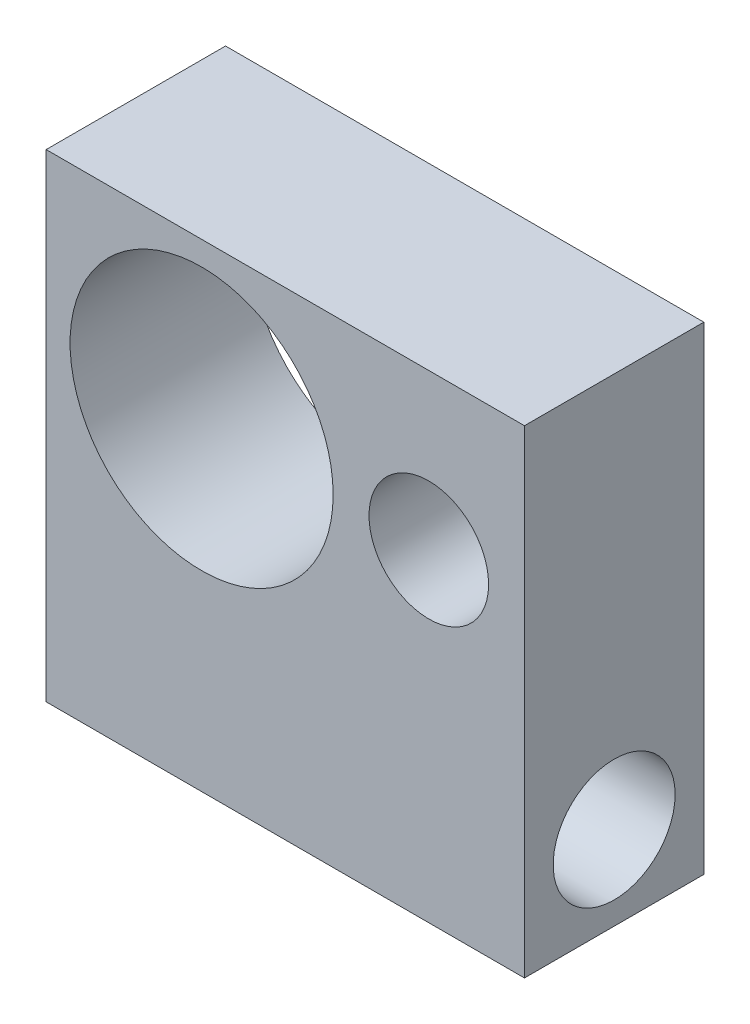
ISO-10303-21;
HEADER;
FILE_DESCRIPTION(('STEP AP214'),'2;1');
FILE_NAME('part.step','',(''),(''),'','','');
FILE_SCHEMA(('AUTOMOTIVE_DESIGN { 1 0 10303 214 1 1 1 1 }'));
ENDSEC;
DATA;
#1=APPLICATION_CONTEXT('core data for automotive mechanical design processes');
#2=APPLICATION_PROTOCOL_DEFINITION('international standard','automotive_design',2000,#1);
#3=PRODUCT_CONTEXT('',#1,'mechanical');
#4=PRODUCT('Part','Part','',(#3));
#5=PRODUCT_RELATED_PRODUCT_CATEGORY('part','',(#4));
#6=PRODUCT_DEFINITION_FORMATION('','',#4);
#7=PRODUCT_DEFINITION_CONTEXT('part definition',#1,'design');
#8=PRODUCT_DEFINITION('design','',#6,#7);
#9=PRODUCT_DEFINITION_SHAPE('','',#8);
#10=(LENGTH_UNIT() NAMED_UNIT(*) SI_UNIT(.MILLI.,.METRE.));
#11=(NAMED_UNIT(*) PLANE_ANGLE_UNIT() SI_UNIT($,.RADIAN.));
#12=(NAMED_UNIT(*) SI_UNIT($,.STERADIAN.) SOLID_ANGLE_UNIT());
#13=UNCERTAINTY_MEASURE_WITH_UNIT(LENGTH_MEASURE(1.E-05),#10,'distance_accuracy_value','');
#14=(GEOMETRIC_REPRESENTATION_CONTEXT(3) GLOBAL_UNCERTAINTY_ASSIGNED_CONTEXT((#13)) GLOBAL_UNIT_ASSIGNED_CONTEXT((#10,
#11,#12)) REPRESENTATION_CONTEXT('',''));
#15=CARTESIAN_POINT('',(0.,0.,0.));
#16=DIRECTION('',(0.,0.,1.));
#17=DIRECTION('',(1.,0.,0.));
#18=AXIS2_PLACEMENT_3D('',#15,#16,#17);
#19=CARTESIAN_POINT('',(0.,0.,15.));
#20=DIRECTION('',(0.,0.,-1.));
#21=DIRECTION('',(-1.,0.,0.));
#22=AXIS2_PLACEMENT_3D('',#19,#20,#21);
#23=PLANE('',#22);
#24=DIRECTION('',(0.,1.,0.));
#25=VECTOR('',#24,1.);
#26=CARTESIAN_POINT('',(20.,-20.,15.));
#27=LINE('',#26,#25);
#28=CARTESIAN_POINT('',(20.,-20.,15.));
#29=VERTEX_POINT('',#28);
#30=CARTESIAN_POINT('',(20.,20.,15.));
#31=VERTEX_POINT('',#30);
#32=EDGE_CURVE('E92',#29,#31,#27,.T.);
#33=ORIENTED_EDGE('',*,*,#32,.T.);
#34=DIRECTION('',(-1.,0.,0.));
#35=VECTOR('',#34,1.);
#36=CARTESIAN_POINT('',(-20.,20.,15.));
#37=LINE('',#36,#35);
#38=CARTESIAN_POINT('',(-20.,20.,15.));
#39=VERTEX_POINT('',#38);
#40=EDGE_CURVE('E87',#31,#39,#37,.T.);
#41=ORIENTED_EDGE('',*,*,#40,.T.);
#42=DIRECTION('',(0.,-1.,0.));
#43=VECTOR('',#42,1.);
#44=CARTESIAN_POINT('',(-20.,-20.,15.));
#45=LINE('',#44,#43);
#46=CARTESIAN_POINT('',(-20.,-20.,15.));
#47=VERTEX_POINT('',#46);
#48=EDGE_CURVE('E90',#39,#47,#45,.T.);
#49=ORIENTED_EDGE('',*,*,#48,.T.);
#50=DIRECTION('',(1.,0.,0.));
#51=VECTOR('',#50,1.);
#52=CARTESIAN_POINT('',(-20.,-20.,15.));
#53=LINE('',#52,#51);
#54=EDGE_CURVE('E57',#47,#29,#53,.T.);
#55=ORIENTED_EDGE('',*,*,#54,.T.);
#56=EDGE_LOOP('',(#33,#41,#49,#55));
#57=FACE_BOUND('',#56,.T.);
#58=CARTESIAN_POINT('',(12.,7.,15.));
#59=DIRECTION('',(0.,0.,1.));
#60=DIRECTION('',(1.,0.,0.));
#61=AXIS2_PLACEMENT_3D('',#58,#59,#60);
#62=CIRCLE('',#61,5.);
#63=CARTESIAN_POINT('',(17.,7.,15.));
#64=VERTEX_POINT('',#63);
#65=EDGE_CURVE('E112',#64,#64,#62,.T.);
#66=ORIENTED_EDGE('',*,*,#65,.F.);
#67=EDGE_LOOP('',(#66));
#68=FACE_BOUND('',#67,.T.);
#69=CARTESIAN_POINT('',(-7.,7.,15.));
#70=DIRECTION('',(0.,0.,1.));
#71=DIRECTION('',(1.,0.,0.));
#72=AXIS2_PLACEMENT_3D('',#69,#70,#71);
#73=CIRCLE('',#72,11.);
#74=CARTESIAN_POINT('',(4.,7.,15.));
#75=VERTEX_POINT('',#74);
#76=EDGE_CURVE('E134',#75,#75,#73,.T.);
#77=ORIENTED_EDGE('',*,*,#76,.F.);
#78=EDGE_LOOP('',(#77));
#79=FACE_BOUND('',#78,.T.);
#80=ADVANCED_FACE('F39',(#57,#68,#79),#23,.F.);
#81=CARTESIAN_POINT('',(0.,0.,0.));
#82=DIRECTION('',(0.,0.,-1.));
#83=DIRECTION('',(-1.,0.,0.));
#84=AXIS2_PLACEMENT_3D('',#81,#82,#83);
#85=PLANE('',#84);
#86=CARTESIAN_POINT('',(12.,7.,0.));
#87=DIRECTION('',(0.,0.,1.));
#88=DIRECTION('',(1.,0.,0.));
#89=AXIS2_PLACEMENT_3D('',#86,#87,#88);
#90=CIRCLE('',#89,5.);
#91=CARTESIAN_POINT('',(17.,7.,0.));
#92=VERTEX_POINT('',#91);
#93=EDGE_CURVE('E130',#92,#92,#90,.T.);
#94=ORIENTED_EDGE('',*,*,#93,.T.);
#95=EDGE_LOOP('',(#94));
#96=FACE_BOUND('',#95,.T.);
#97=DIRECTION('',(0.,1.,0.));
#98=VECTOR('',#97,1.);
#99=CARTESIAN_POINT('',(20.,-20.,0.));
#100=LINE('',#99,#98);
#101=CARTESIAN_POINT('',(20.,-20.,0.));
#102=VERTEX_POINT('',#101);
#103=CARTESIAN_POINT('',(20.,20.,0.));
#104=VERTEX_POINT('',#103);
#105=EDGE_CURVE('E108',#102,#104,#100,.T.);
#106=ORIENTED_EDGE('',*,*,#105,.F.);
#107=DIRECTION('',(1.,0.,0.));
#108=VECTOR('',#107,1.);
#109=CARTESIAN_POINT('',(-20.,-20.,0.));
#110=LINE('',#109,#108);
#111=CARTESIAN_POINT('',(-20.,-20.,0.));
#112=VERTEX_POINT('',#111);
#113=EDGE_CURVE('E80',#112,#102,#110,.T.);
#114=ORIENTED_EDGE('',*,*,#113,.F.);
#115=DIRECTION('',(0.,-1.,0.));
#116=VECTOR('',#115,1.);
#117=CARTESIAN_POINT('',(-20.,-20.,0.));
#118=LINE('',#117,#116);
#119=CARTESIAN_POINT('',(-20.,20.,0.));
#120=VERTEX_POINT('',#119);
#121=EDGE_CURVE('E74',#120,#112,#118,.T.);
#122=ORIENTED_EDGE('',*,*,#121,.F.);
#123=DIRECTION('',(-1.,0.,0.));
#124=VECTOR('',#123,1.);
#125=CARTESIAN_POINT('',(-20.,20.,0.));
#126=LINE('',#125,#124);
#127=EDGE_CURVE('E97',#104,#120,#126,.T.);
#128=ORIENTED_EDGE('',*,*,#127,.F.);
#129=EDGE_LOOP('',(#106,#114,#122,#128));
#130=FACE_BOUND('',#129,.T.);
#131=CARTESIAN_POINT('',(-7.,7.,0.));
#132=DIRECTION('',(0.,0.,1.));
#133=DIRECTION('',(1.,0.,0.));
#134=AXIS2_PLACEMENT_3D('',#131,#132,#133);
#135=CIRCLE('',#134,11.);
#136=CARTESIAN_POINT('',(4.,7.,0.));
#137=VERTEX_POINT('',#136);
#138=EDGE_CURVE('E138',#137,#137,#135,.T.);
#139=ORIENTED_EDGE('',*,*,#138,.T.);
#140=EDGE_LOOP('',(#139));
#141=FACE_BOUND('',#140,.T.);
#142=ADVANCED_FACE('F125',(#96,#130,#141),#85,.T.);
#143=CARTESIAN_POINT('',(20.,-20.,15.));
#144=DIRECTION('',(-1.,0.,0.));
#145=DIRECTION('',(0.,0.,1.));
#146=AXIS2_PLACEMENT_3D('',#143,#144,#145);
#147=PLANE('',#146);
#148=CARTESIAN_POINT('',(20.,-13.,7.5));
#149=DIRECTION('',(1.,0.,0.));
#150=DIRECTION('',(0.,0.,-1.));
#151=AXIS2_PLACEMENT_3D('',#148,#149,#150);
#152=CIRCLE('',#151,5.1);
#153=CARTESIAN_POINT('',(20.,-13.,2.4));
#154=VERTEX_POINT('',#153);
#155=EDGE_CURVE('E146',#154,#154,#152,.T.);
#156=ORIENTED_EDGE('',*,*,#155,.F.);
#157=EDGE_LOOP('',(#156));
#158=FACE_BOUND('',#157,.T.);
#159=ORIENTED_EDGE('',*,*,#105,.T.);
#160=DIRECTION('',(0.,0.,-1.));
#161=VECTOR('',#160,1.);
#162=CARTESIAN_POINT('',(20.,20.,15.));
#163=LINE('',#162,#161);
#164=EDGE_CURVE('E11',#31,#104,#163,.T.);
#165=ORIENTED_EDGE('',*,*,#164,.F.);
#166=ORIENTED_EDGE('',*,*,#32,.F.);
#167=DIRECTION('',(0.,0.,-1.));
#168=VECTOR('',#167,1.);
#169=CARTESIAN_POINT('',(20.,-20.,15.));
#170=LINE('',#169,#168);
#171=EDGE_CURVE('E104',#29,#102,#170,.T.);
#172=ORIENTED_EDGE('',*,*,#171,.T.);
#173=EDGE_LOOP('',(#159,#165,#166,#172));
#174=FACE_BOUND('',#173,.T.);
#175=ADVANCED_FACE('F41',(#158,#174),#147,.F.);
#176=CARTESIAN_POINT('',(-20.,20.,15.));
#177=DIRECTION('',(0.,-1.,0.));
#178=DIRECTION('',(0.,0.,-1.));
#179=AXIS2_PLACEMENT_3D('',#176,#177,#178);
#180=PLANE('',#179);
#181=ORIENTED_EDGE('',*,*,#127,.T.);
#182=DIRECTION('',(0.,0.,-1.));
#183=VECTOR('',#182,1.);
#184=CARTESIAN_POINT('',(-20.,20.,15.));
#185=LINE('',#184,#183);
#186=EDGE_CURVE('E49',#39,#120,#185,.T.);
#187=ORIENTED_EDGE('',*,*,#186,.F.);
#188=ORIENTED_EDGE('',*,*,#40,.F.);
#189=ORIENTED_EDGE('',*,*,#164,.T.);
#190=EDGE_LOOP('',(#181,#187,#188,#189));
#191=FACE_BOUND('',#190,.T.);
#192=ADVANCED_FACE('F96',(#191),#180,.F.);
#193=CARTESIAN_POINT('',(-20.,-20.,15.));
#194=DIRECTION('',(1.,0.,0.));
#195=DIRECTION('',(0.,0.,-1.));
#196=AXIS2_PLACEMENT_3D('',#193,#194,#195);
#197=PLANE('',#196);
#198=CARTESIAN_POINT('',(-20.,-13.,7.5));
#199=DIRECTION('',(1.,0.,0.));
#200=DIRECTION('',(0.,0.,-1.));
#201=AXIS2_PLACEMENT_3D('',#198,#199,#200);
#202=CIRCLE('',#201,5.1);
#203=CARTESIAN_POINT('',(-20.,-13.,2.4));
#204=VERTEX_POINT('',#203);
#205=EDGE_CURVE('E142',#204,#204,#202,.T.);
#206=ORIENTED_EDGE('',*,*,#205,.T.);
#207=EDGE_LOOP('',(#206));
#208=FACE_BOUND('',#207,.T.);
#209=ORIENTED_EDGE('',*,*,#121,.T.);
#210=DIRECTION('',(0.,0.,-1.));
#211=VECTOR('',#210,1.);
#212=CARTESIAN_POINT('',(-20.,-20.,15.));
#213=LINE('',#212,#211);
#214=EDGE_CURVE('E99',#47,#112,#213,.T.);
#215=ORIENTED_EDGE('',*,*,#214,.F.);
#216=ORIENTED_EDGE('',*,*,#48,.F.);
#217=ORIENTED_EDGE('',*,*,#186,.T.);
#218=EDGE_LOOP('',(#209,#215,#216,#217));
#219=FACE_BOUND('',#218,.T.);
#220=ADVANCED_FACE('F100',(#208,#219),#197,.F.);
#221=CARTESIAN_POINT('',(-20.,-20.,15.));
#222=DIRECTION('',(0.,1.,0.));
#223=DIRECTION('',(0.,0.,1.));
#224=AXIS2_PLACEMENT_3D('',#221,#222,#223);
#225=PLANE('',#224);
#226=ORIENTED_EDGE('',*,*,#113,.T.);
#227=ORIENTED_EDGE('',*,*,#171,.F.);
#228=ORIENTED_EDGE('',*,*,#54,.F.);
#229=ORIENTED_EDGE('',*,*,#214,.T.);
#230=EDGE_LOOP('',(#226,#227,#228,#229));
#231=FACE_BOUND('',#230,.T.);
#232=ADVANCED_FACE('F122',(#231),#225,.F.);
#233=CARTESIAN_POINT('',(12.,7.,15.));
#234=DIRECTION('',(0.,0.,-1.));
#235=DIRECTION('',(-1.,0.,0.));
#236=AXIS2_PLACEMENT_3D('',#233,#234,#235);
#237=CYLINDRICAL_SURFACE('',#236,5.);
#238=ORIENTED_EDGE('',*,*,#65,.T.);
#239=EDGE_LOOP('',(#238));
#240=FACE_BOUND('',#239,.T.);
#241=ORIENTED_EDGE('',*,*,#93,.F.);
#242=EDGE_LOOP('',(#241));
#243=FACE_BOUND('',#242,.T.);
#244=ADVANCED_FACE('F174',(#240,#243),#237,.F.);
#245=CARTESIAN_POINT('',(-7.,7.,15.));
#246=DIRECTION('',(0.,0.,-1.));
#247=DIRECTION('',(-1.,0.,0.));
#248=AXIS2_PLACEMENT_3D('',#245,#246,#247);
#249=CYLINDRICAL_SURFACE('',#248,11.);
#250=ORIENTED_EDGE('',*,*,#76,.T.);
#251=EDGE_LOOP('',(#250));
#252=FACE_BOUND('',#251,.T.);
#253=ORIENTED_EDGE('',*,*,#138,.F.);
#254=EDGE_LOOP('',(#253));
#255=FACE_BOUND('',#254,.T.);
#256=ADVANCED_FACE('F158',(#252,#255),#249,.F.);
#257=CARTESIAN_POINT('',(-20.,-13.,7.5));
#258=DIRECTION('',(1.,0.,0.));
#259=DIRECTION('',(0.,0.,-1.));
#260=AXIS2_PLACEMENT_3D('',#257,#258,#259);
#261=CYLINDRICAL_SURFACE('',#260,5.1);
#262=ORIENTED_EDGE('',*,*,#205,.F.);
#263=EDGE_LOOP('',(#262));
#264=FACE_BOUND('',#263,.T.);
#265=ORIENTED_EDGE('',*,*,#155,.T.);
#266=EDGE_LOOP('',(#265));
#267=FACE_BOUND('',#266,.T.);
#268=ADVANCED_FACE('F155',(#264,#267),#261,.F.);
#269=CLOSED_SHELL('',(#80,#142,#175,#192,#220,#232,#244,#256,#268));
#270=MANIFOLD_SOLID_BREP('B2',#269);
#271=ADVANCED_BREP_SHAPE_REPRESENTATION('',(#18,#270),#14);
#272=SHAPE_DEFINITION_REPRESENTATION(#9,#271);
ENDSEC;
END-ISO-10303-21;
